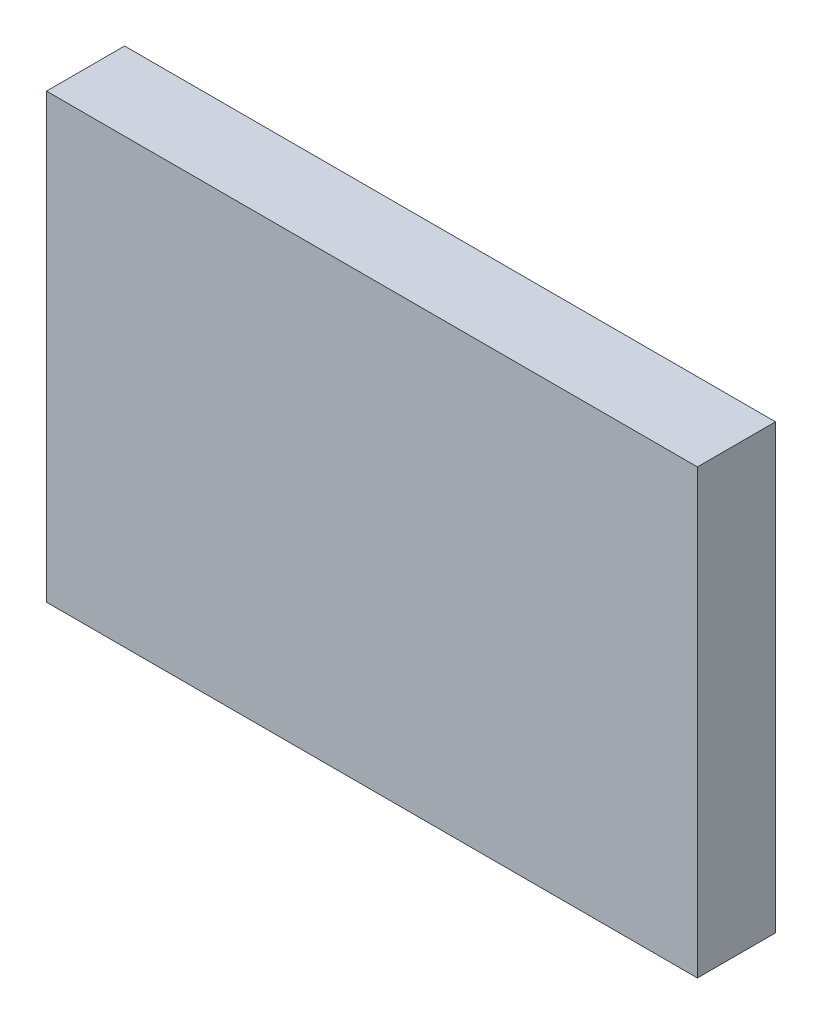
ISO-10303-21;
HEADER;
FILE_DESCRIPTION(('STEP AP214'),'2;1');
FILE_NAME('part.step','',(''),(''),'','','');
FILE_SCHEMA(('AUTOMOTIVE_DESIGN { 1 0 10303 214 1 1 1 1 }'));
ENDSEC;
DATA;
#1=APPLICATION_CONTEXT('core data for automotive mechanical design processes');
#2=APPLICATION_PROTOCOL_DEFINITION('international standard','automotive_design',2000,#1);
#3=PRODUCT_CONTEXT('',#1,'mechanical');
#4=PRODUCT('Part','Part','',(#3));
#5=PRODUCT_RELATED_PRODUCT_CATEGORY('part','',(#4));
#6=PRODUCT_DEFINITION_FORMATION('','',#4);
#7=PRODUCT_DEFINITION_CONTEXT('part definition',#1,'design');
#8=PRODUCT_DEFINITION('design','',#6,#7);
#9=PRODUCT_DEFINITION_SHAPE('','',#8);
#10=(LENGTH_UNIT() NAMED_UNIT(*) SI_UNIT(.MILLI.,.METRE.));
#11=(NAMED_UNIT(*) PLANE_ANGLE_UNIT() SI_UNIT($,.RADIAN.));
#12=(NAMED_UNIT(*) SI_UNIT($,.STERADIAN.) SOLID_ANGLE_UNIT());
#13=UNCERTAINTY_MEASURE_WITH_UNIT(LENGTH_MEASURE(1.E-05),#10,'distance_accuracy_value','');
#14=(GEOMETRIC_REPRESENTATION_CONTEXT(3) GLOBAL_UNCERTAINTY_ASSIGNED_CONTEXT((#13)) GLOBAL_UNIT_ASSIGNED_CONTEXT((#10,
#11,#12)) REPRESENTATION_CONTEXT('',''));
#15=CARTESIAN_POINT('',(0.,0.,0.));
#16=DIRECTION('',(0.,0.,1.));
#17=DIRECTION('',(1.,0.,0.));
#18=AXIS2_PLACEMENT_3D('',#15,#16,#17);
#19=CARTESIAN_POINT('',(62.5,42.5,15.));
#20=DIRECTION('',(-1.,0.,0.));
#21=DIRECTION('',(0.,0.,1.));
#22=AXIS2_PLACEMENT_3D('',#19,#20,#21);
#23=PLANE('',#22);
#24=DIRECTION('',(0.,1.,0.));
#25=VECTOR('',#24,1.);
#26=CARTESIAN_POINT('',(62.5,42.5,0.));
#27=LINE('',#26,#25);
#28=CARTESIAN_POINT('',(62.5,-42.5,0.));
#29=VERTEX_POINT('',#28);
#30=CARTESIAN_POINT('',(62.5,42.5,0.));
#31=VERTEX_POINT('',#30);
#32=EDGE_CURVE('E107',#29,#31,#27,.T.);
#33=ORIENTED_EDGE('',*,*,#32,.T.);
#34=DIRECTION('',(0.,0.,-1.));
#35=VECTOR('',#34,1.);
#36=CARTESIAN_POINT('',(62.5,42.5,15.));
#37=LINE('',#36,#35);
#38=CARTESIAN_POINT('',(62.5,42.5,15.));
#39=VERTEX_POINT('',#38);
#40=EDGE_CURVE('E11',#39,#31,#37,.T.);
#41=ORIENTED_EDGE('',*,*,#40,.F.);
#42=DIRECTION('',(0.,1.,0.));
#43=VECTOR('',#42,1.);
#44=CARTESIAN_POINT('',(62.5,42.5,15.));
#45=LINE('',#44,#43);
#46=CARTESIAN_POINT('',(62.5,-42.5,15.));
#47=VERTEX_POINT('',#46);
#48=EDGE_CURVE('E91',#47,#39,#45,.T.);
#49=ORIENTED_EDGE('',*,*,#48,.F.);
#50=DIRECTION('',(0.,0.,-1.));
#51=VECTOR('',#50,1.);
#52=CARTESIAN_POINT('',(62.5,-42.5,15.));
#53=LINE('',#52,#51);
#54=EDGE_CURVE('E103',#47,#29,#53,.T.);
#55=ORIENTED_EDGE('',*,*,#54,.T.);
#56=EDGE_LOOP('',(#33,#41,#49,#55));
#57=FACE_BOUND('',#56,.T.);
#58=ADVANCED_FACE('F39',(#57),#23,.F.);
#59=CARTESIAN_POINT('',(-62.5,42.5,15.));
#60=DIRECTION('',(0.,-1.,0.));
#61=DIRECTION('',(0.,0.,-1.));
#62=AXIS2_PLACEMENT_3D('',#59,#60,#61);
#63=PLANE('',#62);
#64=DIRECTION('',(-1.,0.,0.));
#65=VECTOR('',#64,1.);
#66=CARTESIAN_POINT('',(-62.5,42.5,0.));
#67=LINE('',#66,#65);
#68=CARTESIAN_POINT('',(-62.5,42.5,0.));
#69=VERTEX_POINT('',#68);
#70=EDGE_CURVE('E96',#31,#69,#67,.T.);
#71=ORIENTED_EDGE('',*,*,#70,.T.);
#72=DIRECTION('',(0.,0.,-1.));
#73=VECTOR('',#72,1.);
#74=CARTESIAN_POINT('',(-62.5,42.5,15.));
#75=LINE('',#74,#73);
#76=CARTESIAN_POINT('',(-62.5,42.5,15.));
#77=VERTEX_POINT('',#76);
#78=EDGE_CURVE('E48',#77,#69,#75,.T.);
#79=ORIENTED_EDGE('',*,*,#78,.F.);
#80=DIRECTION('',(-1.,0.,0.));
#81=VECTOR('',#80,1.);
#82=CARTESIAN_POINT('',(-62.5,42.5,15.));
#83=LINE('',#82,#81);
#84=EDGE_CURVE('E86',#39,#77,#83,.T.);
#85=ORIENTED_EDGE('',*,*,#84,.F.);
#86=ORIENTED_EDGE('',*,*,#40,.T.);
#87=EDGE_LOOP('',(#71,#79,#85,#86));
#88=FACE_BOUND('',#87,.T.);
#89=ADVANCED_FACE('F95',(#88),#63,.F.);
#90=CARTESIAN_POINT('',(-62.5,42.5,15.));
#91=DIRECTION('',(1.,0.,0.));
#92=DIRECTION('',(0.,0.,-1.));
#93=AXIS2_PLACEMENT_3D('',#90,#91,#92);
#94=PLANE('',#93);
#95=DIRECTION('',(0.,-1.,0.));
#96=VECTOR('',#95,1.);
#97=CARTESIAN_POINT('',(-62.5,42.5,0.));
#98=LINE('',#97,#96);
#99=CARTESIAN_POINT('',(-62.5,-42.5,0.));
#100=VERTEX_POINT('',#99);
#101=EDGE_CURVE('E73',#69,#100,#98,.T.);
#102=ORIENTED_EDGE('',*,*,#101,.T.);
#103=DIRECTION('',(0.,0.,-1.));
#104=VECTOR('',#103,1.);
#105=CARTESIAN_POINT('',(-62.5,-42.5,15.));
#106=LINE('',#105,#104);
#107=CARTESIAN_POINT('',(-62.5,-42.5,15.));
#108=VERTEX_POINT('',#107);
#109=EDGE_CURVE('E98',#108,#100,#106,.T.);
#110=ORIENTED_EDGE('',*,*,#109,.F.);
#111=DIRECTION('',(0.,-1.,0.));
#112=VECTOR('',#111,1.);
#113=CARTESIAN_POINT('',(-62.5,42.5,15.));
#114=LINE('',#113,#112);
#115=EDGE_CURVE('E89',#77,#108,#114,.T.);
#116=ORIENTED_EDGE('',*,*,#115,.F.);
#117=ORIENTED_EDGE('',*,*,#78,.T.);
#118=EDGE_LOOP('',(#102,#110,#116,#117));
#119=FACE_BOUND('',#118,.T.);
#120=ADVANCED_FACE('F99',(#119),#94,.F.);
#121=CARTESIAN_POINT('',(-62.5,-42.5,15.));
#122=DIRECTION('',(0.,1.,0.));
#123=DIRECTION('',(0.,0.,1.));
#124=AXIS2_PLACEMENT_3D('',#121,#122,#123);
#125=PLANE('',#124);
#126=DIRECTION('',(1.,0.,0.));
#127=VECTOR('',#126,1.);
#128=CARTESIAN_POINT('',(-62.5,-42.5,0.));
#129=LINE('',#128,#127);
#130=EDGE_CURVE('E79',#100,#29,#129,.T.);
#131=ORIENTED_EDGE('',*,*,#130,.T.);
#132=ORIENTED_EDGE('',*,*,#54,.F.);
#133=DIRECTION('',(1.,0.,0.));
#134=VECTOR('',#133,1.);
#135=CARTESIAN_POINT('',(-62.5,-42.5,15.));
#136=LINE('',#135,#134);
#137=EDGE_CURVE('E56',#108,#47,#136,.T.);
#138=ORIENTED_EDGE('',*,*,#137,.F.);
#139=ORIENTED_EDGE('',*,*,#109,.T.);
#140=EDGE_LOOP('',(#131,#132,#138,#139));
#141=FACE_BOUND('',#140,.T.);
#142=ADVANCED_FACE('F120',(#141),#125,.F.);
#143=CARTESIAN_POINT('',(0.,0.,15.));
#144=DIRECTION('',(0.,0.,1.));
#145=DIRECTION('',(1.,0.,0.));
#146=AXIS2_PLACEMENT_3D('',#143,#144,#145);
#147=PLANE('',#146);
#148=ORIENTED_EDGE('',*,*,#48,.T.);
#149=ORIENTED_EDGE('',*,*,#84,.T.);
#150=ORIENTED_EDGE('',*,*,#115,.T.);
#151=ORIENTED_EDGE('',*,*,#137,.T.);
#152=EDGE_LOOP('',(#148,#149,#150,#151));
#153=FACE_BOUND('',#152,.T.);
#154=ADVANCED_FACE('F87',(#153),#147,.T.);
#155=CARTESIAN_POINT('',(0.,0.,0.));
#156=DIRECTION('',(0.,0.,1.));
#157=DIRECTION('',(1.,0.,0.));
#158=AXIS2_PLACEMENT_3D('',#155,#156,#157);
#159=PLANE('',#158);
#160=ORIENTED_EDGE('',*,*,#32,.F.);
#161=ORIENTED_EDGE('',*,*,#130,.F.);
#162=ORIENTED_EDGE('',*,*,#101,.F.);
#163=ORIENTED_EDGE('',*,*,#70,.F.);
#164=EDGE_LOOP('',(#160,#161,#162,#163));
#165=FACE_BOUND('',#164,.T.);
#166=ADVANCED_FACE('F123',(#165),#159,.F.);
#167=CLOSED_SHELL('',(#58,#89,#120,#142,#154,#166));
#168=MANIFOLD_SOLID_BREP('B2',#167);
#169=ADVANCED_BREP_SHAPE_REPRESENTATION('',(#18,#168),#14);
#170=SHAPE_DEFINITION_REPRESENTATION(#9,#169);
ENDSEC;
END-ISO-10303-21;
